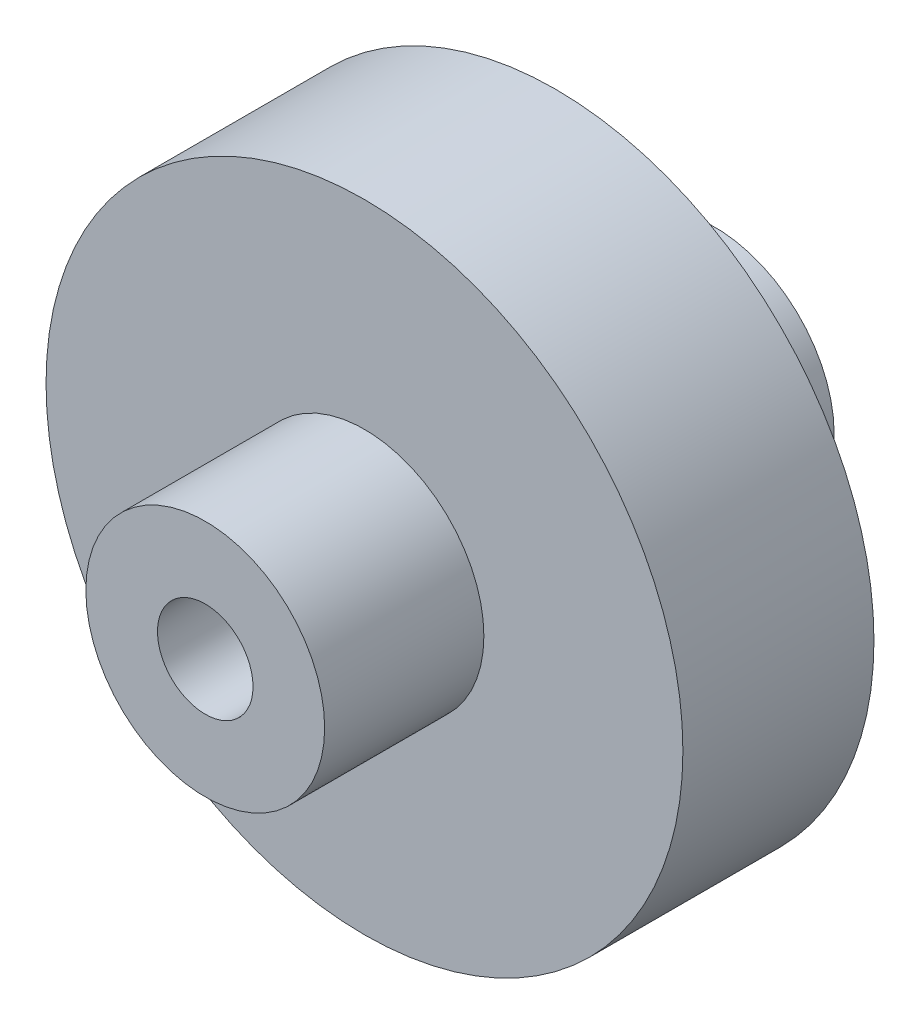
ISO-10303-21;
HEADER;
FILE_DESCRIPTION(('STEP AP214'),'2;1');
FILE_NAME('part.step','',(''),(''),'','','');
FILE_SCHEMA(('AUTOMOTIVE_DESIGN { 1 0 10303 214 1 1 1 1 }'));
ENDSEC;
DATA;
#1=APPLICATION_CONTEXT('core data for automotive mechanical design processes');
#2=APPLICATION_PROTOCOL_DEFINITION('international standard','automotive_design',2000,#1);
#3=PRODUCT_CONTEXT('',#1,'mechanical');
#4=PRODUCT('Part','Part','',(#3));
#5=PRODUCT_RELATED_PRODUCT_CATEGORY('part','',(#4));
#6=PRODUCT_DEFINITION_FORMATION('','',#4);
#7=PRODUCT_DEFINITION_CONTEXT('part definition',#1,'design');
#8=PRODUCT_DEFINITION('design','',#6,#7);
#9=PRODUCT_DEFINITION_SHAPE('','',#8);
#10=(LENGTH_UNIT() NAMED_UNIT(*) SI_UNIT(.MILLI.,.METRE.));
#11=(NAMED_UNIT(*) PLANE_ANGLE_UNIT() SI_UNIT($,.RADIAN.));
#12=(NAMED_UNIT(*) SI_UNIT($,.STERADIAN.) SOLID_ANGLE_UNIT());
#13=UNCERTAINTY_MEASURE_WITH_UNIT(LENGTH_MEASURE(1.E-05),#10,'distance_accuracy_value','');
#14=(GEOMETRIC_REPRESENTATION_CONTEXT(3) GLOBAL_UNCERTAINTY_ASSIGNED_CONTEXT((#13)) GLOBAL_UNIT_ASSIGNED_CONTEXT((#10,
#11,#12)) REPRESENTATION_CONTEXT('',''));
#15=CARTESIAN_POINT('',(0.,0.,0.));
#16=DIRECTION('',(0.,0.,1.));
#17=DIRECTION('',(1.,0.,0.));
#18=AXIS2_PLACEMENT_3D('',#15,#16,#17);
#19=CARTESIAN_POINT('',(0.,0.,32.));
#20=DIRECTION('',(0.,0.,-1.));
#21=DIRECTION('',(-1.,0.,0.));
#22=AXIS2_PLACEMENT_3D('',#19,#20,#21);
#23=CYLINDRICAL_SURFACE('',#22,20.);
#24=CARTESIAN_POINT('',(0.,0.,22.));
#25=DIRECTION('',(0.,0.,1.));
#26=DIRECTION('',(1.,0.,0.));
#27=AXIS2_PLACEMENT_3D('',#24,#25,#26);
#28=CIRCLE('',#27,20.);
#29=CARTESIAN_POINT('',(20.,0.,22.));
#30=VERTEX_POINT('',#29);
#31=EDGE_CURVE('E113',#30,#30,#28,.T.);
#32=ORIENTED_EDGE('',*,*,#31,.F.);
#33=EDGE_LOOP('',(#32));
#34=FACE_BOUND('',#33,.T.);
#35=CARTESIAN_POINT('',(0.,0.,10.));
#36=DIRECTION('',(0.,0.,-1.));
#37=DIRECTION('',(-1.,0.,0.));
#38=AXIS2_PLACEMENT_3D('',#35,#36,#37);
#39=CIRCLE('',#38,20.);
#40=CARTESIAN_POINT('',(-20.,0.,10.));
#41=VERTEX_POINT('',#40);
#42=EDGE_CURVE('E104',#41,#41,#39,.T.);
#43=ORIENTED_EDGE('',*,*,#42,.F.);
#44=EDGE_LOOP('',(#43));
#45=FACE_BOUND('',#44,.T.);
#46=ADVANCED_FACE('F35',(#34,#45),#23,.T.);
#47=CARTESIAN_POINT('',(0.,0.,0.));
#48=DIRECTION('',(0.,0.,1.));
#49=DIRECTION('',(1.,0.,0.));
#50=AXIS2_PLACEMENT_3D('',#47,#48,#49);
#51=PLANE('',#50);
#52=CARTESIAN_POINT('',(0.,0.,0.));
#53=DIRECTION('',(0.,0.,1.));
#54=DIRECTION('',(1.,0.,0.));
#55=AXIS2_PLACEMENT_3D('',#52,#53,#54);
#56=CIRCLE('',#55,3.);
#57=CARTESIAN_POINT('',(3.,0.,0.));
#58=VERTEX_POINT('',#57);
#59=EDGE_CURVE('E119',#58,#58,#56,.T.);
#60=ORIENTED_EDGE('',*,*,#59,.T.);
#61=EDGE_LOOP('',(#60));
#62=FACE_BOUND('',#61,.T.);
#63=CARTESIAN_POINT('',(0.,0.,0.));
#64=DIRECTION('',(0.,0.,-1.));
#65=DIRECTION('',(-1.,0.,0.));
#66=AXIS2_PLACEMENT_3D('',#63,#64,#65);
#67=CIRCLE('',#66,7.5);
#68=CARTESIAN_POINT('',(-7.5,0.,0.));
#69=VERTEX_POINT('',#68);
#70=EDGE_CURVE('E99',#69,#69,#67,.T.);
#71=ORIENTED_EDGE('',*,*,#70,.T.);
#72=EDGE_LOOP('',(#71));
#73=FACE_BOUND('',#72,.T.);
#74=ADVANCED_FACE('F145',(#62,#73),#51,.F.);
#75=CARTESIAN_POINT('',(0.,0.,32.));
#76=DIRECTION('',(0.,0.,1.));
#77=DIRECTION('',(1.,0.,0.));
#78=AXIS2_PLACEMENT_3D('',#75,#76,#77);
#79=PLANE('',#78);
#80=CARTESIAN_POINT('',(0.,0.,32.));
#81=DIRECTION('',(0.,0.,1.));
#82=DIRECTION('',(1.,0.,0.));
#83=AXIS2_PLACEMENT_3D('',#80,#81,#82);
#84=CIRCLE('',#83,3.);
#85=CARTESIAN_POINT('',(3.,0.,32.));
#86=VERTEX_POINT('',#85);
#87=EDGE_CURVE('E118',#86,#86,#84,.T.);
#88=ORIENTED_EDGE('',*,*,#87,.F.);
#89=EDGE_LOOP('',(#88));
#90=FACE_BOUND('',#89,.T.);
#91=CARTESIAN_POINT('',(0.,0.,32.));
#92=DIRECTION('',(0.,0.,1.));
#93=DIRECTION('',(1.,0.,0.));
#94=AXIS2_PLACEMENT_3D('',#91,#92,#93);
#95=CIRCLE('',#94,7.5);
#96=CARTESIAN_POINT('',(7.5,0.,32.));
#97=VERTEX_POINT('',#96);
#98=EDGE_CURVE('E109',#97,#97,#95,.T.);
#99=ORIENTED_EDGE('',*,*,#98,.T.);
#100=EDGE_LOOP('',(#99));
#101=FACE_BOUND('',#100,.T.);
#102=ADVANCED_FACE('F150',(#90,#101),#79,.T.);
#103=CARTESIAN_POINT('',(0.,0.,0.));
#104=DIRECTION('',(0.,0.,1.));
#105=DIRECTION('',(1.,0.,0.));
#106=AXIS2_PLACEMENT_3D('',#103,#104,#105);
#107=CYLINDRICAL_SURFACE('',#106,3.);
#108=DIRECTION('',(0.,0.,1.));
#109=VECTOR('',#108,1.);
#110=CARTESIAN_POINT('',(1.20612049908472,2.74686609460447,0.));
#111=LINE('',#110,#109);
#112=CARTESIAN_POINT('',(1.20612049908472,2.74686609460447,25.));
#113=VERTEX_POINT('',#112);
#114=CARTESIAN_POINT('',(1.20612049908472,2.74686609460447,23.));
#115=VERTEX_POINT('',#114);
#116=EDGE_CURVE('E126',#113,#115,#111,.F.);
#117=ORIENTED_EDGE('',*,*,#116,.T.);
#118=CARTESIAN_POINT('',(0.,0.,23.));
#119=DIRECTION('',(0.,0.,-1.));
#120=DIRECTION('',(-1.,0.,0.));
#121=AXIS2_PLACEMENT_3D('',#118,#119,#120);
#122=CIRCLE('',#121,3.);
#123=CARTESIAN_POINT('',(-0.793879500915279,2.89305294421421,23.));
#124=VERTEX_POINT('',#123);
#125=EDGE_CURVE('E11',#115,#124,#122,.F.);
#126=ORIENTED_EDGE('',*,*,#125,.T.);
#127=DIRECTION('',(0.,0.,1.));
#128=VECTOR('',#127,1.);
#129=CARTESIAN_POINT('',(-0.793879500915279,2.89305294421421,0.));
#130=LINE('',#129,#128);
#131=CARTESIAN_POINT('',(-0.793879500915279,2.89305294421421,25.));
#132=VERTEX_POINT('',#131);
#133=EDGE_CURVE('E42',#124,#132,#130,.T.);
#134=ORIENTED_EDGE('',*,*,#133,.T.);
#135=CARTESIAN_POINT('',(0.,0.,25.));
#136=DIRECTION('',(0.,0.,-1.));
#137=DIRECTION('',(-1.,0.,0.));
#138=AXIS2_PLACEMENT_3D('',#135,#136,#137);
#139=CIRCLE('',#138,3.);
#140=EDGE_CURVE('E122',#113,#132,#139,.F.);
#141=ORIENTED_EDGE('',*,*,#140,.F.);
#142=EDGE_LOOP('',(#117,#126,#134,#141));
#143=FACE_BOUND('',#142,.T.);
#144=ORIENTED_EDGE('',*,*,#59,.F.);
#145=EDGE_LOOP('',(#144));
#146=FACE_BOUND('',#145,.T.);
#147=ORIENTED_EDGE('',*,*,#87,.T.);
#148=EDGE_LOOP('',(#147));
#149=FACE_BOUND('',#148,.T.);
#150=ADVANCED_FACE('F130',(#143,#146,#149),#107,.F.);
#151=CARTESIAN_POINT('',(0.,0.,22.));
#152=DIRECTION('',(0.,0.,1.));
#153=DIRECTION('',(1.,0.,0.));
#154=AXIS2_PLACEMENT_3D('',#151,#152,#153);
#155=PLANE('',#154);
#156=CARTESIAN_POINT('',(0.,0.,22.));
#157=DIRECTION('',(0.,0.,1.));
#158=DIRECTION('',(1.,0.,0.));
#159=AXIS2_PLACEMENT_3D('',#156,#157,#158);
#160=CIRCLE('',#159,7.5);
#161=CARTESIAN_POINT('',(7.5,0.,22.));
#162=VERTEX_POINT('',#161);
#163=EDGE_CURVE('E110',#162,#162,#160,.T.);
#164=ORIENTED_EDGE('',*,*,#163,.F.);
#165=EDGE_LOOP('',(#164));
#166=FACE_BOUND('',#165,.T.);
#167=ORIENTED_EDGE('',*,*,#31,.T.);
#168=EDGE_LOOP('',(#167));
#169=FACE_BOUND('',#168,.T.);
#170=ADVANCED_FACE('F168',(#166,#169),#155,.T.);
#171=CARTESIAN_POINT('',(0.,0.,22.));
#172=DIRECTION('',(0.,0.,1.));
#173=DIRECTION('',(1.,0.,0.));
#174=AXIS2_PLACEMENT_3D('',#171,#172,#173);
#175=CYLINDRICAL_SURFACE('',#174,7.5);
#176=ORIENTED_EDGE('',*,*,#163,.T.);
#177=EDGE_LOOP('',(#176));
#178=FACE_BOUND('',#177,.T.);
#179=ORIENTED_EDGE('',*,*,#98,.F.);
#180=EDGE_LOOP('',(#179));
#181=FACE_BOUND('',#180,.T.);
#182=ADVANCED_FACE('F159',(#178,#181),#175,.T.);
#183=CARTESIAN_POINT('',(0.,0.,10.));
#184=DIRECTION('',(0.,0.,-1.));
#185=DIRECTION('',(-1.,0.,0.));
#186=AXIS2_PLACEMENT_3D('',#183,#184,#185);
#187=PLANE('',#186);
#188=CARTESIAN_POINT('',(0.,0.,10.));
#189=DIRECTION('',(0.,0.,-1.));
#190=DIRECTION('',(-1.,0.,0.));
#191=AXIS2_PLACEMENT_3D('',#188,#189,#190);
#192=CIRCLE('',#191,7.5);
#193=CARTESIAN_POINT('',(-7.5,0.,10.));
#194=VERTEX_POINT('',#193);
#195=EDGE_CURVE('E101',#194,#194,#192,.T.);
#196=ORIENTED_EDGE('',*,*,#195,.F.);
#197=EDGE_LOOP('',(#196));
#198=FACE_BOUND('',#197,.T.);
#199=ORIENTED_EDGE('',*,*,#42,.T.);
#200=EDGE_LOOP('',(#199));
#201=FACE_BOUND('',#200,.T.);
#202=ADVANCED_FACE('F156',(#198,#201),#187,.T.);
#203=CARTESIAN_POINT('',(0.,0.,10.));
#204=DIRECTION('',(0.,0.,-1.));
#205=DIRECTION('',(-1.,0.,0.));
#206=AXIS2_PLACEMENT_3D('',#203,#204,#205);
#207=CYLINDRICAL_SURFACE('',#206,7.5);
#208=ORIENTED_EDGE('',*,*,#195,.T.);
#209=EDGE_LOOP('',(#208));
#210=FACE_BOUND('',#209,.T.);
#211=ORIENTED_EDGE('',*,*,#70,.F.);
#212=EDGE_LOOP('',(#211));
#213=FACE_BOUND('',#212,.T.);
#214=ADVANCED_FACE('F158',(#210,#213),#207,.T.);
#215=CARTESIAN_POINT('',(-0.793879500915279,2.54271241074747,23.));
#216=DIRECTION('',(-1.,0.,0.));
#217=DIRECTION('',(0.,0.,1.));
#218=AXIS2_PLACEMENT_3D('',#215,#216,#217);
#219=PLANE('',#218);
#220=DIRECTION('',(0.,-1.,0.));
#221=VECTOR('',#220,1.);
#222=CARTESIAN_POINT('',(-0.793879500915279,2.54271241074747,23.));
#223=LINE('',#222,#221);
#224=CARTESIAN_POINT('',(-0.793879500915279,7.37619723027069,23.));
#225=VERTEX_POINT('',#224);
#226=EDGE_CURVE('E79',#225,#124,#223,.T.);
#227=ORIENTED_EDGE('',*,*,#226,.F.);
#228=DIRECTION('',(0.,0.,1.));
#229=VECTOR('',#228,1.);
#230=CARTESIAN_POINT('',(-0.793879500915279,7.37619723027069,23.));
#231=LINE('',#230,#229);
#232=CARTESIAN_POINT('',(-0.793879500915279,7.37619723027069,25.));
#233=VERTEX_POINT('',#232);
#234=EDGE_CURVE('E86',#225,#233,#231,.T.);
#235=ORIENTED_EDGE('',*,*,#234,.T.);
#236=DIRECTION('',(0.,-1.,0.));
#237=VECTOR('',#236,1.);
#238=CARTESIAN_POINT('',(-0.793879500915279,2.54271241074747,25.));
#239=LINE('',#238,#237);
#240=EDGE_CURVE('E93',#233,#132,#239,.T.);
#241=ORIENTED_EDGE('',*,*,#240,.T.);
#242=ORIENTED_EDGE('',*,*,#133,.F.);
#243=EDGE_LOOP('',(#227,#235,#241,#242));
#244=FACE_BOUND('',#243,.T.);
#245=ADVANCED_FACE('F133',(#244),#219,.F.);
#246=CARTESIAN_POINT('',(1.20612049908472,2.54271241074747,23.));
#247=DIRECTION('',(1.,0.,0.));
#248=DIRECTION('',(0.,0.,-1.));
#249=AXIS2_PLACEMENT_3D('',#246,#247,#248);
#250=PLANE('',#249);
#251=DIRECTION('',(0.,1.,0.));
#252=VECTOR('',#251,1.);
#253=CARTESIAN_POINT('',(1.20612049908472,2.54271241074747,25.));
#254=LINE('',#253,#252);
#255=CARTESIAN_POINT('',(1.20612049908472,7.37619723027069,25.));
#256=VERTEX_POINT('',#255);
#257=EDGE_CURVE('E49',#113,#256,#254,.T.);
#258=ORIENTED_EDGE('',*,*,#257,.T.);
#259=DIRECTION('',(0.,0.,1.));
#260=VECTOR('',#259,1.);
#261=CARTESIAN_POINT('',(1.20612049908472,7.37619723027069,23.));
#262=LINE('',#261,#260);
#263=CARTESIAN_POINT('',(1.20612049908472,7.37619723027069,23.));
#264=VERTEX_POINT('',#263);
#265=EDGE_CURVE('E82',#264,#256,#262,.T.);
#266=ORIENTED_EDGE('',*,*,#265,.F.);
#267=DIRECTION('',(0.,1.,0.));
#268=VECTOR('',#267,1.);
#269=CARTESIAN_POINT('',(1.20612049908472,2.54271241074747,23.));
#270=LINE('',#269,#268);
#271=EDGE_CURVE('E72',#115,#264,#270,.T.);
#272=ORIENTED_EDGE('',*,*,#271,.F.);
#273=ORIENTED_EDGE('',*,*,#116,.F.);
#274=EDGE_LOOP('',(#258,#266,#272,#273));
#275=FACE_BOUND('',#274,.T.);
#276=ADVANCED_FACE('F83',(#275),#250,.F.);
#277=CARTESIAN_POINT('',(0.,0.,23.));
#278=DIRECTION('',(0.,0.,-1.));
#279=DIRECTION('',(-1.,0.,0.));
#280=AXIS2_PLACEMENT_3D('',#277,#278,#279);
#281=PLANE('',#280);
#282=ORIENTED_EDGE('',*,*,#271,.T.);
#283=DIRECTION('',(-1.,0.,0.));
#284=VECTOR('',#283,1.);
#285=CARTESIAN_POINT('',(-0.793879500915279,7.37619723027069,23.));
#286=LINE('',#285,#284);
#287=EDGE_CURVE('E76',#264,#225,#286,.T.);
#288=ORIENTED_EDGE('',*,*,#287,.T.);
#289=ORIENTED_EDGE('',*,*,#226,.T.);
#290=ORIENTED_EDGE('',*,*,#125,.F.);
#291=EDGE_LOOP('',(#282,#288,#289,#290));
#292=FACE_BOUND('',#291,.T.);
#293=ADVANCED_FACE('F74',(#292),#281,.F.);
#294=CARTESIAN_POINT('',(0.,0.,25.));
#295=DIRECTION('',(0.,0.,-1.));
#296=DIRECTION('',(-1.,0.,0.));
#297=AXIS2_PLACEMENT_3D('',#294,#295,#296);
#298=PLANE('',#297);
#299=ORIENTED_EDGE('',*,*,#140,.T.);
#300=ORIENTED_EDGE('',*,*,#240,.F.);
#301=DIRECTION('',(-1.,0.,0.));
#302=VECTOR('',#301,1.);
#303=CARTESIAN_POINT('',(-0.793879500915279,7.37619723027069,25.));
#304=LINE('',#303,#302);
#305=EDGE_CURVE('E97',#256,#233,#304,.T.);
#306=ORIENTED_EDGE('',*,*,#305,.F.);
#307=ORIENTED_EDGE('',*,*,#257,.F.);
#308=EDGE_LOOP('',(#299,#300,#306,#307));
#309=FACE_BOUND('',#308,.T.);
#310=ADVANCED_FACE('F135',(#309),#298,.T.);
#311=CARTESIAN_POINT('',(-0.793879500915279,7.37619723027069,23.));
#312=DIRECTION('',(0.,1.,0.));
#313=DIRECTION('',(0.,0.,1.));
#314=AXIS2_PLACEMENT_3D('',#311,#312,#313);
#315=PLANE('',#314);
#316=ORIENTED_EDGE('',*,*,#305,.T.);
#317=ORIENTED_EDGE('',*,*,#234,.F.);
#318=ORIENTED_EDGE('',*,*,#287,.F.);
#319=ORIENTED_EDGE('',*,*,#265,.T.);
#320=EDGE_LOOP('',(#316,#317,#318,#319));
#321=FACE_BOUND('',#320,.T.);
#322=ADVANCED_FACE('F88',(#321),#315,.F.);
#323=CLOSED_SHELL('',(#46,#74,#102,#150,#170,#182,#202,#214,#245,#276,#293,#310,#322));
#324=MANIFOLD_SOLID_BREP('B2',#323);
#325=ADVANCED_BREP_SHAPE_REPRESENTATION('',(#18,#324),#14);
#326=SHAPE_DEFINITION_REPRESENTATION(#9,#325);
ENDSEC;
END-ISO-10303-21;
